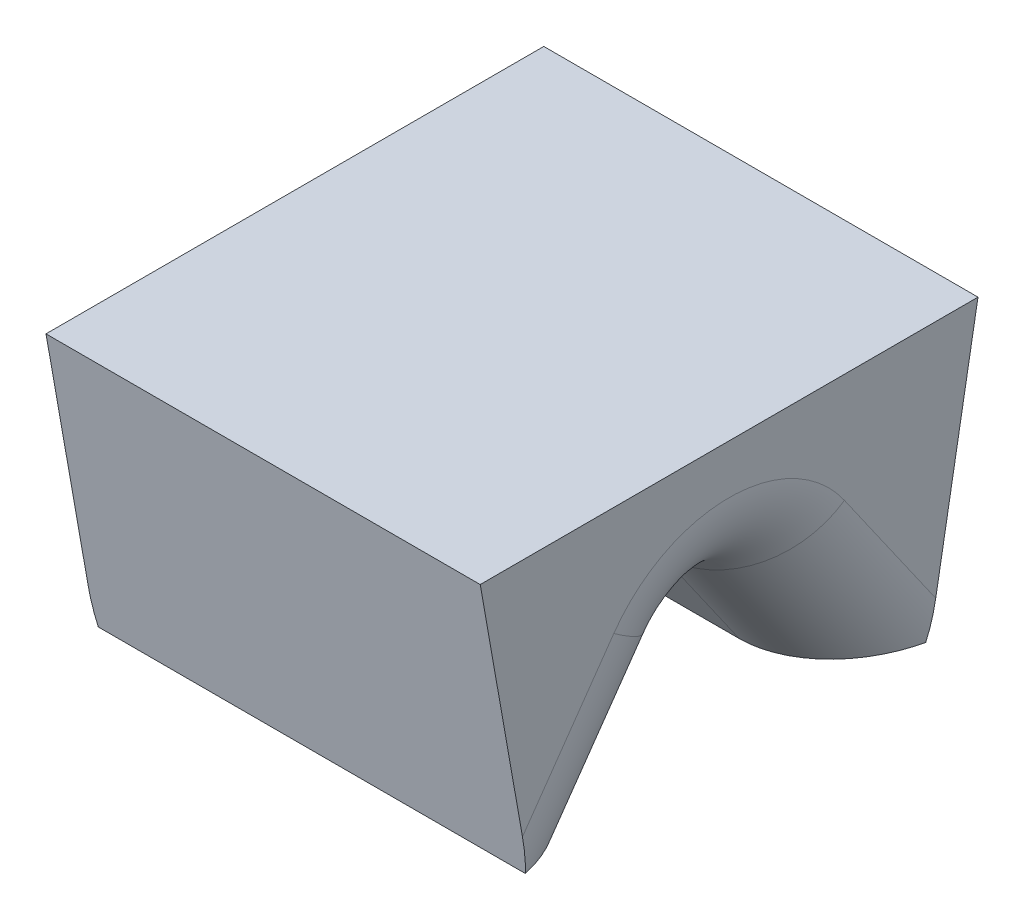
ISO-10303-21;
HEADER;
FILE_DESCRIPTION(('STEP AP214'),'2;1');
FILE_NAME('part.step','',(''),(''),'','','');
FILE_SCHEMA(('AUTOMOTIVE_DESIGN { 1 0 10303 214 1 1 1 1 }'));
ENDSEC;
DATA;
#1=APPLICATION_CONTEXT('core data for automotive mechanical design processes');
#2=APPLICATION_PROTOCOL_DEFINITION('international standard','automotive_design',2000,#1);
#3=PRODUCT_CONTEXT('',#1,'mechanical');
#4=PRODUCT('Part','Part','',(#3));
#5=PRODUCT_RELATED_PRODUCT_CATEGORY('part','',(#4));
#6=PRODUCT_DEFINITION_FORMATION('','',#4);
#7=PRODUCT_DEFINITION_CONTEXT('part definition',#1,'design');
#8=PRODUCT_DEFINITION('design','',#6,#7);
#9=PRODUCT_DEFINITION_SHAPE('','',#8);
#10=(LENGTH_UNIT() NAMED_UNIT(*) SI_UNIT(.MILLI.,.METRE.));
#11=(NAMED_UNIT(*) PLANE_ANGLE_UNIT() SI_UNIT($,.RADIAN.));
#12=(NAMED_UNIT(*) SI_UNIT($,.STERADIAN.) SOLID_ANGLE_UNIT());
#13=UNCERTAINTY_MEASURE_WITH_UNIT(LENGTH_MEASURE(1.E-05),#10,'distance_accuracy_value','');
#14=(GEOMETRIC_REPRESENTATION_CONTEXT(3) GLOBAL_UNCERTAINTY_ASSIGNED_CONTEXT((#13)) GLOBAL_UNIT_ASSIGNED_CONTEXT((#10,
#11,#12)) REPRESENTATION_CONTEXT('',''));
#15=CARTESIAN_POINT('',(0.,0.,0.));
#16=DIRECTION('',(0.,0.,1.));
#17=DIRECTION('',(1.,0.,0.));
#18=AXIS2_PLACEMENT_3D('',#15,#16,#17);
#19=CARTESIAN_POINT('',(0.,0.414017929910338,0.));
#20=DIRECTION('',(0.,1.,0.));
#21=DIRECTION('',(0.,0.,1.));
#22=AXIS2_PLACEMENT_3D('',#19,#20,#21);
#23=PLANE('',#22);
#24=DIRECTION('',(0.,0.,-1.));
#25=VECTOR('',#24,1.);
#26=CARTESIAN_POINT('',(-0.32512,0.414017929910338,1.50859998));
#27=LINE('',#26,#25);
#28=CARTESIAN_POINT('',(-0.32512,0.414017929910338,0.372722531540259));
#29=VERTEX_POINT('',#28);
#30=CARTESIAN_POINT('',(-0.32512,0.414017929910338,-0.372722531540259));
#31=VERTEX_POINT('',#30);
#32=EDGE_CURVE('E142',#29,#31,#27,.T.);
#33=ORIENTED_EDGE('',*,*,#32,.F.);
#34=DIRECTION('',(-1.,0.,0.));
#35=VECTOR('',#34,1.);
#36=CARTESIAN_POINT('',(1.50859998,0.414017929910338,0.372722531540259));
#37=LINE('',#36,#35);
#38=CARTESIAN_POINT('',(0.32512,0.414017929910338,0.372722531540259));
#39=VERTEX_POINT('',#38);
#40=EDGE_CURVE('E57',#39,#29,#37,.T.);
#41=ORIENTED_EDGE('',*,*,#40,.F.);
#42=DIRECTION('',(0.,0.,1.));
#43=VECTOR('',#42,1.);
#44=CARTESIAN_POINT('',(0.32512,0.414017929910338,1.50859998));
#45=LINE('',#44,#43);
#46=CARTESIAN_POINT('',(0.32512,0.414017929910338,-0.372722531540259));
#47=VERTEX_POINT('',#46);
#48=EDGE_CURVE('E12',#47,#39,#45,.T.);
#49=ORIENTED_EDGE('',*,*,#48,.F.);
#50=DIRECTION('',(1.,0.,0.));
#51=VECTOR('',#50,1.);
#52=CARTESIAN_POINT('',(1.50859998,0.414017929910338,-0.372722531540259));
#53=LINE('',#52,#51);
#54=EDGE_CURVE('E129',#31,#47,#53,.T.);
#55=ORIENTED_EDGE('',*,*,#54,.F.);
#56=EDGE_LOOP('',(#33,#41,#49,#55));
#57=FACE_BOUND('',#56,.T.);
#58=ADVANCED_FACE('F42',(#57),#23,.T.);
#59=CARTESIAN_POINT('',(1.50859998,0.,-0.29972));
#60=DIRECTION('',(0.,-0.173648177666931,-0.984807753012208));
#61=DIRECTION('',(0.,0.984807753012208,-0.173648177666931));
#62=AXIS2_PLACEMENT_3D('',#59,#60,#61);
#63=PLANE('',#62);
#64=DIRECTION('',(0.,0.984807753012208,-0.173648177666931));
#65=VECTOR('',#64,1.);
#66=CARTESIAN_POINT('',(-0.32512,0.,-0.29972));
#67=LINE('',#66,#65);
#68=CARTESIAN_POINT('',(-0.32512,0.0551587898238705,-0.309445982869176));
#69=VERTEX_POINT('',#68);
#70=EDGE_CURVE('E141',#69,#31,#67,.T.);
#71=ORIENTED_EDGE('',*,*,#70,.T.);
#72=ORIENTED_EDGE('',*,*,#54,.T.);
#73=DIRECTION('',(0.,-0.984807753012208,0.173648177666931));
#74=VECTOR('',#73,1.);
#75=CARTESIAN_POINT('',(0.32512,0.,-0.29972));
#76=LINE('',#75,#74);
#77=CARTESIAN_POINT('',(0.32512,0.0551587898238704,-0.309445982869176));
#78=VERTEX_POINT('',#77);
#79=EDGE_CURVE('E138',#47,#78,#76,.T.);
#80=ORIENTED_EDGE('',*,*,#79,.T.);
#81=CARTESIAN_POINT('',(0.17526,0.0551587898238704,-0.309445982869176));
#82=DIRECTION('',(0.,-0.173648177666931,-0.984807753012208));
#83=DIRECTION('',(0.,-0.984807753012208,0.173648177666931));
#84=AXIS2_PLACEMENT_3D('',#81,#82,#83);
#85=ELLIPSE('',#84,0.211934044457232,0.14986);
#86=CARTESIAN_POINT('',(0.319791920976639,0.,-0.29972));
#87=VERTEX_POINT('',#86);
#88=EDGE_CURVE('E250',#78,#87,#85,.T.);
#89=ORIENTED_EDGE('',*,*,#88,.T.);
#90=DIRECTION('',(-1.,0.,0.));
#91=VECTOR('',#90,1.);
#92=CARTESIAN_POINT('',(1.50859998,0.,-0.29972));
#93=LINE('',#92,#91);
#94=CARTESIAN_POINT('',(-0.319791920976639,0.,-0.29972));
#95=VERTEX_POINT('',#94);
#96=EDGE_CURVE('E157',#87,#95,#93,.T.);
#97=ORIENTED_EDGE('',*,*,#96,.T.);
#98=CARTESIAN_POINT('',(-0.17526,0.0551587898238705,-0.309445982869176));
#99=DIRECTION('',(0.,-0.173648177666931,-0.984807753012208));
#100=DIRECTION('',(0.,0.984807753012208,-0.173648177666931));
#101=AXIS2_PLACEMENT_3D('',#98,#99,#100);
#102=ELLIPSE('',#101,0.211934044457232,0.14986);
#103=EDGE_CURVE('E243',#95,#69,#102,.T.);
#104=ORIENTED_EDGE('',*,*,#103,.T.);
#105=EDGE_LOOP('',(#71,#72,#80,#89,#97,#104));
#106=FACE_BOUND('',#105,.T.);
#107=ADVANCED_FACE('F137',(#106),#63,.T.);
#108=CARTESIAN_POINT('',(1.50859998,0.,0.29972));
#109=DIRECTION('',(0.,-0.173648177666931,0.984807753012208));
#110=DIRECTION('',(0.,-0.984807753012208,-0.173648177666931));
#111=AXIS2_PLACEMENT_3D('',#108,#109,#110);
#112=PLANE('',#111);
#113=DIRECTION('',(0.,0.984807753012208,0.173648177666931));
#114=VECTOR('',#113,1.);
#115=CARTESIAN_POINT('',(0.32512,0.,0.29972));
#116=LINE('',#115,#114);
#117=CARTESIAN_POINT('',(0.32512,0.0551587898238704,0.309445982869176));
#118=VERTEX_POINT('',#117);
#119=EDGE_CURVE('E148',#118,#39,#116,.T.);
#120=ORIENTED_EDGE('',*,*,#119,.T.);
#121=ORIENTED_EDGE('',*,*,#40,.T.);
#122=DIRECTION('',(0.,-0.984807753012208,-0.173648177666931));
#123=VECTOR('',#122,1.);
#124=CARTESIAN_POINT('',(-0.32512,0.,0.29972));
#125=LINE('',#124,#123);
#126=CARTESIAN_POINT('',(-0.32512,0.0551587898238704,0.309445982869176));
#127=VERTEX_POINT('',#126);
#128=EDGE_CURVE('E159',#29,#127,#125,.T.);
#129=ORIENTED_EDGE('',*,*,#128,.T.);
#130=CARTESIAN_POINT('',(-0.17526,0.0551587898238704,0.309445982869176));
#131=DIRECTION('',(0.,-0.173648177666931,0.984807753012208));
#132=DIRECTION('',(0.,-0.984807753012208,-0.173648177666931));
#133=AXIS2_PLACEMENT_3D('',#130,#131,#132);
#134=ELLIPSE('',#133,0.211934044457232,0.14986);
#135=CARTESIAN_POINT('',(-0.319791920976639,0.,0.29972));
#136=VERTEX_POINT('',#135);
#137=EDGE_CURVE('E297',#127,#136,#134,.T.);
#138=ORIENTED_EDGE('',*,*,#137,.T.);
#139=DIRECTION('',(-1.,0.,0.));
#140=VECTOR('',#139,1.);
#141=CARTESIAN_POINT('',(1.50859998,0.,0.29972));
#142=LINE('',#141,#140);
#143=CARTESIAN_POINT('',(0.319791920976639,0.,0.29972));
#144=VERTEX_POINT('',#143);
#145=EDGE_CURVE('E150',#144,#136,#142,.T.);
#146=ORIENTED_EDGE('',*,*,#145,.F.);
#147=CARTESIAN_POINT('',(0.17526,0.0551587898238704,0.309445982869176));
#148=DIRECTION('',(0.,-0.173648177666931,0.984807753012208));
#149=DIRECTION('',(0.,0.984807753012208,0.173648177666931));
#150=AXIS2_PLACEMENT_3D('',#147,#148,#149);
#151=ELLIPSE('',#150,0.211934044457232,0.14986);
#152=EDGE_CURVE('E261',#144,#118,#151,.T.);
#153=ORIENTED_EDGE('',*,*,#152,.T.);
#154=EDGE_LOOP('',(#120,#121,#129,#138,#146,#153));
#155=FACE_BOUND('',#154,.T.);
#156=ADVANCED_FACE('F212',(#155),#112,.T.);
#157=CARTESIAN_POINT('',(-0.32512,0.88916002,1.50859998));
#158=DIRECTION('',(-1.,0.,0.));
#159=DIRECTION('',(0.,-1.,0.));
#160=AXIS2_PLACEMENT_3D('',#157,#158,#159);
#161=PLANE('',#160);
#162=ORIENTED_EDGE('',*,*,#128,.F.);
#163=ORIENTED_EDGE('',*,*,#32,.T.);
#164=ORIENTED_EDGE('',*,*,#70,.F.);
#165=DIRECTION('',(0.,-0.819152044288993,-0.573576436351044));
#166=VECTOR('',#165,1.);
#167=CARTESIAN_POINT('',(-0.32512,0.250461384311527,-0.172693633977006));
#168=LINE('',#167,#166);
#169=CARTESIAN_POINT('',(-0.32512,0.250461384311527,-0.172693633977006));
#170=VERTEX_POINT('',#169);
#171=EDGE_CURVE('E305',#69,#170,#168,.F.);
#172=ORIENTED_EDGE('',*,*,#171,.T.);
#173=CARTESIAN_POINT('',(-0.32512,0.12954,0.));
#174=DIRECTION('',(-1.,0.,0.));
#175=DIRECTION('',(0.,-1.,0.));
#176=AXIS2_PLACEMENT_3D('',#173,#174,#175);
#177=CIRCLE('',#176,0.21082);
#178=CARTESIAN_POINT('',(-0.32512,0.250461384311527,0.172693633977006));
#179=VERTEX_POINT('',#178);
#180=EDGE_CURVE('E303',#170,#179,#177,.F.);
#181=ORIENTED_EDGE('',*,*,#180,.T.);
#182=DIRECTION('',(0.,0.819152044288993,-0.573576436351044));
#183=VECTOR('',#182,1.);
#184=CARTESIAN_POINT('',(-0.32512,0.0859561647515674,0.287881428787732));
#185=LINE('',#184,#183);
#186=EDGE_CURVE('E300',#179,#127,#185,.F.);
#187=ORIENTED_EDGE('',*,*,#186,.T.);
#188=EDGE_LOOP('',(#162,#163,#164,#172,#181,#187));
#189=FACE_BOUND('',#188,.T.);
#190=ADVANCED_FACE('F330',(#189),#161,.T.);
#191=CARTESIAN_POINT('',(0.32512,-0.00999998,1.50859998));
#192=DIRECTION('',(1.,0.,0.));
#193=DIRECTION('',(0.,1.,0.));
#194=AXIS2_PLACEMENT_3D('',#191,#192,#193);
#195=PLANE('',#194);
#196=ORIENTED_EDGE('',*,*,#79,.F.);
#197=ORIENTED_EDGE('',*,*,#48,.T.);
#198=ORIENTED_EDGE('',*,*,#119,.F.);
#199=DIRECTION('',(0.,-0.819152044288993,0.573576436351044));
#200=VECTOR('',#199,1.);
#201=CARTESIAN_POINT('',(0.32512,0.250461384311527,0.172693633977006));
#202=LINE('',#201,#200);
#203=CARTESIAN_POINT('',(0.32512,0.250461384311527,0.172693633977006));
#204=VERTEX_POINT('',#203);
#205=EDGE_CURVE('E247',#118,#204,#202,.F.);
#206=ORIENTED_EDGE('',*,*,#205,.T.);
#207=CARTESIAN_POINT('',(0.32512,0.12954,0.));
#208=DIRECTION('',(1.,0.,0.));
#209=DIRECTION('',(0.,1.,0.));
#210=AXIS2_PLACEMENT_3D('',#207,#208,#209);
#211=CIRCLE('',#210,0.21082);
#212=CARTESIAN_POINT('',(0.32512,0.250461384311527,-0.172693633977006));
#213=VERTEX_POINT('',#212);
#214=EDGE_CURVE('E242',#204,#213,#211,.F.);
#215=ORIENTED_EDGE('',*,*,#214,.T.);
#216=DIRECTION('',(0.,0.819152044288993,0.573576436351044));
#217=VECTOR('',#216,1.);
#218=CARTESIAN_POINT('',(0.32512,0.0859561647515673,-0.287881428787732));
#219=LINE('',#218,#217);
#220=EDGE_CURVE('E146',#213,#78,#219,.F.);
#221=ORIENTED_EDGE('',*,*,#220,.T.);
#222=EDGE_LOOP('',(#196,#197,#198,#206,#215,#221));
#223=FACE_BOUND('',#222,.T.);
#224=ADVANCED_FACE('F144',(#223),#195,.T.);
#225=CARTESIAN_POINT('',(0.,0.,0.));
#226=DIRECTION('',(0.,1.,0.));
#227=DIRECTION('',(0.,0.,1.));
#228=AXIS2_PLACEMENT_3D('',#225,#226,#227);
#229=PLANE('',#228);
#230=ORIENTED_EDGE('',*,*,#96,.F.);
#231=CARTESIAN_POINT('',(0.17526,0.,-0.348068583302375));
#232=DIRECTION('',(0.,1.,0.));
#233=DIRECTION('',(0.,0.,-1.));
#234=AXIS2_PLACEMENT_3D('',#231,#232,#233);
#235=ELLIPSE('',#234,0.182945279871791,0.14986);
#236=CARTESIAN_POINT('',(0.17526,0.,-0.165123303430583));
#237=VERTEX_POINT('',#236);
#238=EDGE_CURVE('E252',#87,#237,#235,.F.);
#239=ORIENTED_EDGE('',*,*,#238,.T.);
#240=CARTESIAN_POINT('',(0.17526,0.,-0.165123303430583));
#241=DIRECTION('',(-1.,0.,0.));
#242=VECTOR('',#241,1.);
#243=LINE('',#240,#242);
#244=CARTESIAN_POINT('',(-0.17526,0.,-0.165123303430583));
#245=VERTEX_POINT('',#244);
#246=EDGE_CURVE('E237',#237,#245,#243,.T.);
#247=ORIENTED_EDGE('',*,*,#246,.T.);
#248=CARTESIAN_POINT('',(-0.17526,0.,-0.348068583302375));
#249=DIRECTION('',(0.,1.,0.));
#250=DIRECTION('',(0.,0.,1.));
#251=AXIS2_PLACEMENT_3D('',#248,#249,#250);
#252=ELLIPSE('',#251,0.182945279871791,0.14986);
#253=EDGE_CURVE('E282',#245,#95,#252,.F.);
#254=ORIENTED_EDGE('',*,*,#253,.T.);
#255=EDGE_LOOP('',(#230,#239,#247,#254));
#256=FACE_BOUND('',#255,.T.);
#257=ADVANCED_FACE('F180',(#256),#229,.F.);
#258=CARTESIAN_POINT('',(-0.17526,0.,0.165123303430583));
#259=DIRECTION('',(1.,0.,0.));
#260=VECTOR('',#259,1.);
#261=LINE('',#258,#260);
#262=CARTESIAN_POINT('',(-0.17526,0.,0.165123303430583));
#263=VERTEX_POINT('',#262);
#264=CARTESIAN_POINT('',(0.17526,0.,0.165123303430583));
#265=VERTEX_POINT('',#264);
#266=EDGE_CURVE('E161',#263,#265,#261,.T.);
#267=ORIENTED_EDGE('',*,*,#266,.T.);
#268=CARTESIAN_POINT('',(0.17526,0.,0.348068583302375));
#269=DIRECTION('',(0.,1.,0.));
#270=DIRECTION('',(0.,0.,-1.));
#271=AXIS2_PLACEMENT_3D('',#268,#269,#270);
#272=ELLIPSE('',#271,0.182945279871791,0.14986);
#273=EDGE_CURVE('E64',#265,#144,#272,.F.);
#274=ORIENTED_EDGE('',*,*,#273,.T.);
#275=ORIENTED_EDGE('',*,*,#145,.T.);
#276=CARTESIAN_POINT('',(-0.17526,0.,0.348068583302375));
#277=DIRECTION('',(0.,1.,0.));
#278=DIRECTION('',(0.,0.,1.));
#279=AXIS2_PLACEMENT_3D('',#276,#277,#278);
#280=ELLIPSE('',#279,0.182945279871791,0.14986);
#281=EDGE_CURVE('E293',#136,#263,#280,.F.);
#282=ORIENTED_EDGE('',*,*,#281,.T.);
#283=EDGE_LOOP('',(#267,#274,#275,#282));
#284=FACE_BOUND('',#283,.T.);
#285=ADVANCED_FACE('F169',(#284),#229,.F.);
#286=CARTESIAN_POINT('',(-1.20142,0.16450521955996,-0.049935508619857));
#287=DIRECTION('',(0.,0.573576436351044,-0.819152044288993));
#288=DIRECTION('',(0.,0.819152044288993,0.573576436351044));
#289=AXIS2_PLACEMENT_3D('',#286,#287,#288);
#290=PLANE('',#289);
#291=ORIENTED_EDGE('',*,*,#246,.F.);
#292=DIRECTION('',(0.,0.819152044288993,0.573576436351044));
#293=VECTOR('',#292,1.);
#294=CARTESIAN_POINT('',(0.17526,0.164505219559959,-0.0499355086198571));
#295=LINE('',#294,#293);
#296=CARTESIAN_POINT('',(0.17526,0.16450521955996,-0.049935508619857));
#297=VERTEX_POINT('',#296);
#298=EDGE_CURVE('E240',#237,#297,#295,.T.);
#299=ORIENTED_EDGE('',*,*,#298,.T.);
#300=DIRECTION('',(1.,0.,0.));
#301=VECTOR('',#300,1.);
#302=CARTESIAN_POINT('',(-1.20142,0.16450521955996,-0.049935508619857));
#303=LINE('',#302,#301);
#304=CARTESIAN_POINT('',(-0.17526,0.16450521955996,-0.049935508619857));
#305=VERTEX_POINT('',#304);
#306=EDGE_CURVE('E279',#305,#297,#303,.T.);
#307=ORIENTED_EDGE('',*,*,#306,.F.);
#308=DIRECTION('',(0.,-0.819152044288993,-0.573576436351044));
#309=VECTOR('',#308,1.);
#310=CARTESIAN_POINT('',(-0.17526,0.,-0.165123303430583));
#311=LINE('',#310,#309);
#312=EDGE_CURVE('E287',#305,#245,#311,.T.);
#313=ORIENTED_EDGE('',*,*,#312,.T.);
#314=EDGE_LOOP('',(#291,#299,#307,#313));
#315=FACE_BOUND('',#314,.T.);
#316=ADVANCED_FACE('F179',(#315),#290,.F.);
#317=CARTESIAN_POINT('',(-1.20142,-0.00999998000000012,0.17212536480853));
#318=DIRECTION('',(0.,0.573576436351044,0.819152044288993));
#319=DIRECTION('',(0.,-0.819152044288993,0.573576436351044));
#320=AXIS2_PLACEMENT_3D('',#317,#318,#319);
#321=PLANE('',#320);
#322=DIRECTION('',(1.,0.,0.));
#323=VECTOR('',#322,1.);
#324=CARTESIAN_POINT('',(-1.20142,0.16450521955996,0.049935508619857));
#325=LINE('',#324,#323);
#326=CARTESIAN_POINT('',(-0.17526,0.16450521955996,0.049935508619857));
#327=VERTEX_POINT('',#326);
#328=CARTESIAN_POINT('',(0.17526,0.16450521955996,0.049935508619857));
#329=VERTEX_POINT('',#328);
#330=EDGE_CURVE('E152',#327,#329,#325,.T.);
#331=ORIENTED_EDGE('',*,*,#330,.T.);
#332=DIRECTION('',(0.,-0.819152044288993,0.573576436351044));
#333=VECTOR('',#332,1.);
#334=CARTESIAN_POINT('',(0.17526,0.,0.165123303430583));
#335=LINE('',#334,#333);
#336=EDGE_CURVE('E254',#329,#265,#335,.T.);
#337=ORIENTED_EDGE('',*,*,#336,.T.);
#338=ORIENTED_EDGE('',*,*,#266,.F.);
#339=DIRECTION('',(0.,0.819152044288993,-0.573576436351044));
#340=VECTOR('',#339,1.);
#341=CARTESIAN_POINT('',(-0.17526,0.164505219559959,0.049935508619857));
#342=LINE('',#341,#340);
#343=EDGE_CURVE('E307',#263,#327,#342,.T.);
#344=ORIENTED_EDGE('',*,*,#343,.T.);
#345=EDGE_LOOP('',(#331,#337,#338,#344));
#346=FACE_BOUND('',#345,.T.);
#347=ADVANCED_FACE('F217',(#346),#321,.F.);
#348=CARTESIAN_POINT('',(-1.20142,0.12954,0.));
#349=DIRECTION('',(1.,0.,0.));
#350=DIRECTION('',(0.,0.,-1.));
#351=AXIS2_PLACEMENT_3D('',#348,#349,#350);
#352=CYLINDRICAL_SURFACE('',#351,0.06096);
#353=ORIENTED_EDGE('',*,*,#306,.T.);
#354=CARTESIAN_POINT('',(0.17526,0.12954,0.));
#355=DIRECTION('',(1.,0.,0.));
#356=DIRECTION('',(0.,1.,0.));
#357=AXIS2_PLACEMENT_3D('',#354,#355,#356);
#358=CIRCLE('',#357,0.06096);
#359=EDGE_CURVE('E50',#297,#329,#358,.T.);
#360=ORIENTED_EDGE('',*,*,#359,.T.);
#361=ORIENTED_EDGE('',*,*,#330,.F.);
#362=CARTESIAN_POINT('',(-0.17526,0.12954,0.));
#363=DIRECTION('',(-1.,0.,0.));
#364=DIRECTION('',(0.,-1.,0.));
#365=AXIS2_PLACEMENT_3D('',#362,#363,#364);
#366=CIRCLE('',#365,0.06096);
#367=EDGE_CURVE('E291',#327,#305,#366,.T.);
#368=ORIENTED_EDGE('',*,*,#367,.T.);
#369=EDGE_LOOP('',(#353,#360,#361,#368));
#370=FACE_BOUND('',#369,.T.);
#371=ADVANCED_FACE('F194',(#370),#352,.F.);
#372=CARTESIAN_POINT('',(-0.17526,0.250461384311527,-0.172693633977006));
#373=DIRECTION('',(0.,0.819152044288993,0.573576436351044));
#374=DIRECTION('',(0.,-0.573576436351044,0.819152044288993));
#375=AXIS2_PLACEMENT_3D('',#372,#373,#374);
#376=CYLINDRICAL_SURFACE('',#375,0.14986);
#377=ORIENTED_EDGE('',*,*,#253,.F.);
#378=ORIENTED_EDGE('',*,*,#312,.F.);
#379=CARTESIAN_POINT('',(-0.17526,0.250461384311527,-0.172693633977006));
#380=DIRECTION('',(0.,0.819152044288994,0.573576436351043));
#381=DIRECTION('',(0.,-0.573576436351043,0.819152044288994));
#382=AXIS2_PLACEMENT_3D('',#379,#380,#381);
#383=CIRCLE('',#382,0.14986);
#384=EDGE_CURVE('E272',#170,#305,#383,.T.);
#385=ORIENTED_EDGE('',*,*,#384,.F.);
#386=ORIENTED_EDGE('',*,*,#171,.F.);
#387=ORIENTED_EDGE('',*,*,#103,.F.);
#388=EDGE_LOOP('',(#377,#378,#385,#386,#387));
#389=FACE_BOUND('',#388,.T.);
#390=ADVANCED_FACE('F190',(#389),#376,.T.);
#391=CARTESIAN_POINT('',(-0.17526,0.12954,0.));
#392=DIRECTION('',(-1.,0.,0.));
#393=DIRECTION('',(0.,-1.,0.));
#394=AXIS2_PLACEMENT_3D('',#391,#392,#393);
#395=TOROIDAL_SURFACE('',#394,0.21082,0.14986);
#396=ORIENTED_EDGE('',*,*,#384,.T.);
#397=ORIENTED_EDGE('',*,*,#367,.F.);
#398=CARTESIAN_POINT('',(-0.17526,0.250461384311527,0.172693633977006));
#399=DIRECTION('',(0.,-0.819152044288994,0.573576436351044));
#400=DIRECTION('',(0.,-0.573576436351044,-0.819152044288994));
#401=AXIS2_PLACEMENT_3D('',#398,#399,#400);
#402=CIRCLE('',#401,0.14986);
#403=EDGE_CURVE('E268',#179,#327,#402,.T.);
#404=ORIENTED_EDGE('',*,*,#403,.F.);
#405=ORIENTED_EDGE('',*,*,#180,.F.);
#406=EDGE_LOOP('',(#396,#397,#404,#405));
#407=FACE_BOUND('',#406,.T.);
#408=ADVANCED_FACE('F186',(#407),#395,.T.);
#409=CARTESIAN_POINT('',(-0.17526,0.0759561847515674,0.294883490165678));
#410=DIRECTION('',(0.,-0.819152044288993,0.573576436351044));
#411=DIRECTION('',(0.,-0.573576436351044,-0.819152044288993));
#412=AXIS2_PLACEMENT_3D('',#409,#410,#411);
#413=CYLINDRICAL_SURFACE('',#412,0.14986);
#414=ORIENTED_EDGE('',*,*,#137,.F.);
#415=ORIENTED_EDGE('',*,*,#186,.F.);
#416=ORIENTED_EDGE('',*,*,#403,.T.);
#417=ORIENTED_EDGE('',*,*,#343,.F.);
#418=ORIENTED_EDGE('',*,*,#281,.F.);
#419=EDGE_LOOP('',(#414,#415,#416,#417,#418));
#420=FACE_BOUND('',#419,.T.);
#421=ADVANCED_FACE('F182',(#420),#413,.T.);
#422=CARTESIAN_POINT('',(0.17526,0.0759561847515672,0.294883490165678));
#423=DIRECTION('',(0.,0.819152044288993,-0.573576436351044));
#424=DIRECTION('',(0.,0.573576436351044,0.819152044288993));
#425=AXIS2_PLACEMENT_3D('',#422,#423,#424);
#426=CYLINDRICAL_SURFACE('',#425,0.14986);
#427=ORIENTED_EDGE('',*,*,#273,.F.);
#428=ORIENTED_EDGE('',*,*,#336,.F.);
#429=CARTESIAN_POINT('',(0.17526,0.250461384311527,0.172693633977006));
#430=DIRECTION('',(0.,0.819152044288993,-0.573576436351043));
#431=DIRECTION('',(0.,0.573576436351044,0.819152044288994));
#432=AXIS2_PLACEMENT_3D('',#429,#430,#431);
#433=CIRCLE('',#432,0.14986);
#434=EDGE_CURVE('E267',#204,#329,#433,.T.);
#435=ORIENTED_EDGE('',*,*,#434,.F.);
#436=ORIENTED_EDGE('',*,*,#205,.F.);
#437=ORIENTED_EDGE('',*,*,#152,.F.);
#438=EDGE_LOOP('',(#427,#428,#435,#436,#437));
#439=FACE_BOUND('',#438,.T.);
#440=ADVANCED_FACE('F44',(#439),#426,.T.);
#441=CARTESIAN_POINT('',(0.17526,0.12954,0.));
#442=DIRECTION('',(1.,0.,0.));
#443=DIRECTION('',(0.,1.,0.));
#444=AXIS2_PLACEMENT_3D('',#441,#442,#443);
#445=TOROIDAL_SURFACE('',#444,0.21082,0.14986);
#446=ORIENTED_EDGE('',*,*,#434,.T.);
#447=ORIENTED_EDGE('',*,*,#359,.F.);
#448=CARTESIAN_POINT('',(0.17526,0.250461384311527,-0.172693633977006));
#449=DIRECTION('',(0.,-0.819152044288993,-0.573576436351044));
#450=DIRECTION('',(0.,0.573576436351044,-0.819152044288993));
#451=AXIS2_PLACEMENT_3D('',#448,#449,#450);
#452=CIRCLE('',#451,0.14986);
#453=EDGE_CURVE('E266',#213,#297,#452,.T.);
#454=ORIENTED_EDGE('',*,*,#453,.F.);
#455=ORIENTED_EDGE('',*,*,#214,.F.);
#456=EDGE_LOOP('',(#446,#447,#454,#455));
#457=FACE_BOUND('',#456,.T.);
#458=ADVANCED_FACE('F198',(#457),#445,.T.);
#459=CARTESIAN_POINT('',(0.17526,0.250461384311527,-0.172693633977006));
#460=DIRECTION('',(0.,-0.819152044288993,-0.573576436351044));
#461=DIRECTION('',(0.,0.573576436351044,-0.819152044288993));
#462=AXIS2_PLACEMENT_3D('',#459,#460,#461);
#463=CYLINDRICAL_SURFACE('',#462,0.14986);
#464=ORIENTED_EDGE('',*,*,#88,.F.);
#465=ORIENTED_EDGE('',*,*,#220,.F.);
#466=ORIENTED_EDGE('',*,*,#453,.T.);
#467=ORIENTED_EDGE('',*,*,#298,.F.);
#468=ORIENTED_EDGE('',*,*,#238,.F.);
#469=EDGE_LOOP('',(#464,#465,#466,#467,#468));
#470=FACE_BOUND('',#469,.T.);
#471=ADVANCED_FACE('F196',(#470),#463,.T.);
#472=CLOSED_SHELL('',(#58,#107,#156,#190,#224,#257,#285,#316,#347,#371,#390,#408,#421,#440,#458,#471));
#473=MANIFOLD_SOLID_BREP('B2',#472);
#474=ADVANCED_BREP_SHAPE_REPRESENTATION('',(#18,#473),#14);
#475=SHAPE_DEFINITION_REPRESENTATION(#9,#474);
ENDSEC;
END-ISO-10303-21;
